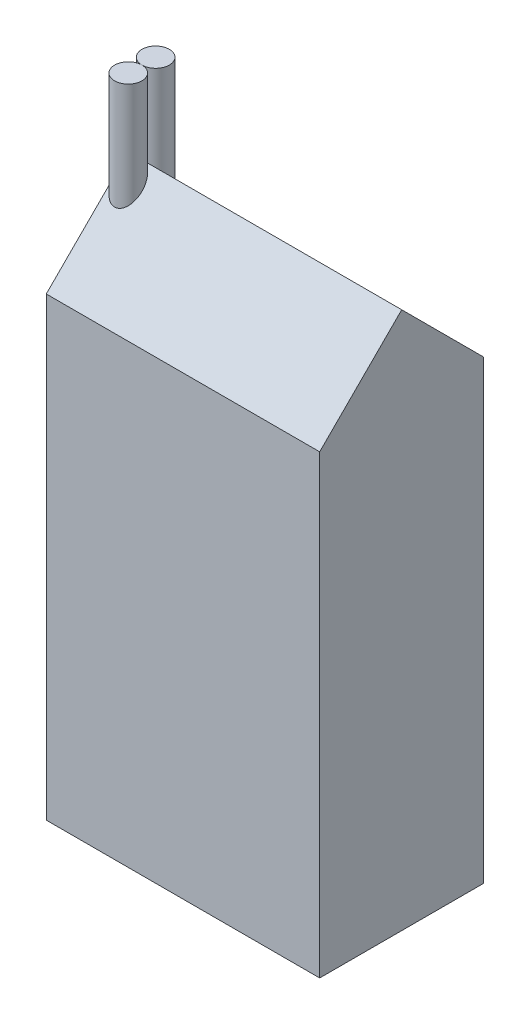
ISO-10303-21;
HEADER;
FILE_DESCRIPTION(('STEP AP214'),'2;1');
FILE_NAME('part.step','',(''),(''),'','','');
FILE_SCHEMA(('AUTOMOTIVE_DESIGN { 1 0 10303 214 1 1 1 1 }'));
ENDSEC;
DATA;
#1=APPLICATION_CONTEXT('core data for automotive mechanical design processes');
#2=APPLICATION_PROTOCOL_DEFINITION('international standard','automotive_design',2000,#1);
#3=PRODUCT_CONTEXT('',#1,'mechanical');
#4=PRODUCT('Part','Part','',(#3));
#5=PRODUCT_RELATED_PRODUCT_CATEGORY('part','',(#4));
#6=PRODUCT_DEFINITION_FORMATION('','',#4);
#7=PRODUCT_DEFINITION_CONTEXT('part definition',#1,'design');
#8=PRODUCT_DEFINITION('design','',#6,#7);
#9=PRODUCT_DEFINITION_SHAPE('','',#8);
#10=(LENGTH_UNIT() NAMED_UNIT(*) SI_UNIT(.MILLI.,.METRE.));
#11=(NAMED_UNIT(*) PLANE_ANGLE_UNIT() SI_UNIT($,.RADIAN.));
#12=(NAMED_UNIT(*) SI_UNIT($,.STERADIAN.) SOLID_ANGLE_UNIT());
#13=UNCERTAINTY_MEASURE_WITH_UNIT(LENGTH_MEASURE(1.E-05),#10,'distance_accuracy_value','');
#14=(GEOMETRIC_REPRESENTATION_CONTEXT(3) GLOBAL_UNCERTAINTY_ASSIGNED_CONTEXT((#13)) GLOBAL_UNIT_ASSIGNED_CONTEXT((#10,
#11,#12)) REPRESENTATION_CONTEXT('',''));
#15=CARTESIAN_POINT('',(0.,0.,0.));
#16=DIRECTION('',(0.,0.,1.));
#17=DIRECTION('',(1.,0.,0.));
#18=AXIS2_PLACEMENT_3D('',#15,#16,#17);
#19=CARTESIAN_POINT('',(-13.5,38.,-1.5));
#20=DIRECTION('',(0.,-1.,0.));
#21=DIRECTION('',(0.,0.,-1.));
#22=AXIS2_PLACEMENT_3D('',#19,#20,#21);
#23=CYLINDRICAL_SURFACE('',#22,1.5);
#24=CARTESIAN_POINT('',(-13.5,0.,-1.5));
#25=DIRECTION('',(0.,1.,0.));
#26=DIRECTION('',(0.,0.,1.));
#27=AXIS2_PLACEMENT_3D('',#24,#25,#26);
#28=CIRCLE('',#27,1.5);
#29=CARTESIAN_POINT('',(-13.5,0.,0.));
#30=VERTEX_POINT('',#29);
#31=EDGE_CURVE('E11',#30,#30,#28,.T.);
#32=ORIENTED_EDGE('',*,*,#31,.T.);
#33=EDGE_LOOP('',(#32));
#34=FACE_BOUND('',#33,.T.);
#35=CARTESIAN_POINT('',(-13.5,38.,-1.5));
#36=DIRECTION('',(0.,1.,0.));
#37=DIRECTION('',(0.,0.,1.));
#38=AXIS2_PLACEMENT_3D('',#35,#36,#37);
#39=CIRCLE('',#38,1.5);
#40=CARTESIAN_POINT('',(-13.5,38.,0.));
#41=VERTEX_POINT('',#40);
#42=EDGE_CURVE('E46',#41,#41,#39,.T.);
#43=ORIENTED_EDGE('',*,*,#42,.F.);
#44=EDGE_LOOP('',(#43));
#45=FACE_BOUND('',#44,.T.);
#46=ADVANCED_FACE('F42',(#34,#45),#23,.T.);
#47=CARTESIAN_POINT('',(-13.5,38.,-1.5));
#48=DIRECTION('',(0.,1.,0.));
#49=DIRECTION('',(0.,0.,1.));
#50=AXIS2_PLACEMENT_3D('',#47,#48,#49);
#51=PLANE('',#50);
#52=ORIENTED_EDGE('',*,*,#42,.T.);
#53=EDGE_LOOP('',(#52));
#54=FACE_BOUND('',#53,.T.);
#55=ADVANCED_FACE('F44',(#54),#51,.T.);
#56=CARTESIAN_POINT('',(-13.5,0.,-1.5));
#57=DIRECTION('',(0.,1.,0.));
#58=DIRECTION('',(0.,0.,1.));
#59=AXIS2_PLACEMENT_3D('',#56,#57,#58);
#60=PLANE('',#59);
#61=ORIENTED_EDGE('',*,*,#31,.F.);
#62=EDGE_LOOP('',(#61));
#63=FACE_BOUND('',#62,.T.);
#64=ADVANCED_FACE('F61',(#63),#60,.F.);
#65=CLOSED_SHELL('',(#46,#55,#64));
#66=MANIFOLD_SOLID_BREP('B2',#65);
#67=CARTESIAN_POINT('',(-13.5,38.,1.5));
#68=DIRECTION('',(0.,-1.,0.));
#69=DIRECTION('',(0.,0.,-1.));
#70=AXIS2_PLACEMENT_3D('',#67,#68,#69);
#71=CYLINDRICAL_SURFACE('',#70,1.5);
#72=CARTESIAN_POINT('',(-13.5,0.,1.5));
#73=DIRECTION('',(0.,-1.,0.));
#74=DIRECTION('',(0.,0.,-1.));
#75=AXIS2_PLACEMENT_3D('',#72,#73,#74);
#76=CIRCLE('',#75,1.5);
#77=CARTESIAN_POINT('',(-13.5,0.,0.));
#78=VERTEX_POINT('',#77);
#79=EDGE_CURVE('E95',#78,#78,#76,.T.);
#80=ORIENTED_EDGE('',*,*,#79,.F.);
#81=EDGE_LOOP('',(#80));
#82=FACE_BOUND('',#81,.T.);
#83=CARTESIAN_POINT('',(-13.5,38.,1.5));
#84=DIRECTION('',(0.,-1.,0.));
#85=DIRECTION('',(0.,0.,-1.));
#86=AXIS2_PLACEMENT_3D('',#83,#84,#85);
#87=CIRCLE('',#86,1.5);
#88=CARTESIAN_POINT('',(-13.5,38.,0.));
#89=VERTEX_POINT('',#88);
#90=EDGE_CURVE('E41',#89,#89,#87,.T.);
#91=ORIENTED_EDGE('',*,*,#90,.T.);
#92=EDGE_LOOP('',(#91));
#93=FACE_BOUND('',#92,.T.);
#94=ADVANCED_FACE('F92',(#82,#93),#71,.T.);
#95=CARTESIAN_POINT('',(-13.5,38.,1.5));
#96=DIRECTION('',(0.,-1.,0.));
#97=DIRECTION('',(0.,0.,-1.));
#98=AXIS2_PLACEMENT_3D('',#95,#96,#97);
#99=PLANE('',#98);
#100=ORIENTED_EDGE('',*,*,#90,.F.);
#101=EDGE_LOOP('',(#100));
#102=FACE_BOUND('',#101,.T.);
#103=ADVANCED_FACE('F107',(#102),#99,.F.);
#104=CARTESIAN_POINT('',(-13.5,0.,1.5));
#105=DIRECTION('',(0.,-1.,0.));
#106=DIRECTION('',(0.,0.,-1.));
#107=AXIS2_PLACEMENT_3D('',#104,#105,#106);
#108=PLANE('',#107);
#109=ORIENTED_EDGE('',*,*,#79,.T.);
#110=EDGE_LOOP('',(#109));
#111=FACE_BOUND('',#110,.T.);
#112=ADVANCED_FACE('F104',(#111),#108,.T.);
#113=CLOSED_SHELL('',(#94,#103,#112));
#114=MANIFOLD_SOLID_BREP('B6',#113);
#115=CARTESIAN_POINT('',(15.,-30.,9.));
#116=DIRECTION('',(-1.,0.,0.));
#117=DIRECTION('',(0.,0.,1.));
#118=AXIS2_PLACEMENT_3D('',#115,#116,#117);
#119=PLANE('',#118);
#120=DIRECTION('',(0.,1.,0.));
#121=VECTOR('',#120,1.);
#122=CARTESIAN_POINT('',(15.,-30.,-9.));
#123=LINE('',#122,#121);
#124=CARTESIAN_POINT('',(15.,-30.,-9.));
#125=VERTEX_POINT('',#124);
#126=CARTESIAN_POINT('',(15.,20.,-9.));
#127=VERTEX_POINT('',#126);
#128=EDGE_CURVE('E205',#125,#127,#123,.T.);
#129=ORIENTED_EDGE('',*,*,#128,.T.);
#130=DIRECTION('',(0.,0.707106781186549,0.707106781186547));
#131=VECTOR('',#130,1.);
#132=CARTESIAN_POINT('',(15.,30.,1.00000000000001));
#133=LINE('',#132,#131);
#134=CARTESIAN_POINT('',(15.,29.,0.));
#135=VERTEX_POINT('',#134);
#136=EDGE_CURVE('E143',#127,#135,#133,.T.);
#137=ORIENTED_EDGE('',*,*,#136,.T.);
#138=DIRECTION('',(0.,0.707106781186547,-0.707106781186549));
#139=VECTOR('',#138,1.);
#140=CARTESIAN_POINT('',(15.,20.,9.));
#141=LINE('',#140,#139);
#142=CARTESIAN_POINT('',(15.,20.,9.));
#143=VERTEX_POINT('',#142);
#144=EDGE_CURVE('E153',#135,#143,#141,.F.);
#145=ORIENTED_EDGE('',*,*,#144,.T.);
#146=DIRECTION('',(0.,1.,0.));
#147=VECTOR('',#146,1.);
#148=CARTESIAN_POINT('',(15.,-30.,9.));
#149=LINE('',#148,#147);
#150=CARTESIAN_POINT('',(15.,-30.,9.));
#151=VERTEX_POINT('',#150);
#152=EDGE_CURVE('E187',#151,#143,#149,.T.);
#153=ORIENTED_EDGE('',*,*,#152,.F.);
#154=DIRECTION('',(0.,0.,-1.));
#155=VECTOR('',#154,1.);
#156=CARTESIAN_POINT('',(15.,-30.,9.));
#157=LINE('',#156,#155);
#158=EDGE_CURVE('E197',#151,#125,#157,.T.);
#159=ORIENTED_EDGE('',*,*,#158,.T.);
#160=EDGE_LOOP('',(#129,#137,#145,#153,#159));
#161=FACE_BOUND('',#160,.T.);
#162=ADVANCED_FACE('F133',(#161),#119,.F.);
#163=CARTESIAN_POINT('',(-15.,-30.,9.));
#164=DIRECTION('',(1.,0.,0.));
#165=DIRECTION('',(0.,0.,-1.));
#166=AXIS2_PLACEMENT_3D('',#163,#164,#165);
#167=PLANE('',#166);
#168=DIRECTION('',(0.,-0.707106781186547,0.707106781186549));
#169=VECTOR('',#168,1.);
#170=CARTESIAN_POINT('',(-15.,20.,9.));
#171=LINE('',#170,#169);
#172=CARTESIAN_POINT('',(-15.,20.,9.));
#173=VERTEX_POINT('',#172);
#174=CARTESIAN_POINT('',(-15.,29.,0.));
#175=VERTEX_POINT('',#174);
#176=EDGE_CURVE('E196',#173,#175,#171,.F.);
#177=ORIENTED_EDGE('',*,*,#176,.T.);
#178=DIRECTION('',(0.,-0.707106781186549,-0.707106781186547));
#179=VECTOR('',#178,1.);
#180=CARTESIAN_POINT('',(-15.,30.,1.00000000000001));
#181=LINE('',#180,#179);
#182=CARTESIAN_POINT('',(-15.,20.,-9.));
#183=VERTEX_POINT('',#182);
#184=EDGE_CURVE('E211',#175,#183,#181,.T.);
#185=ORIENTED_EDGE('',*,*,#184,.T.);
#186=DIRECTION('',(0.,-1.,0.));
#187=VECTOR('',#186,1.);
#188=CARTESIAN_POINT('',(-15.,-30.,-9.));
#189=LINE('',#188,#187);
#190=CARTESIAN_POINT('',(-15.,-30.,-9.));
#191=VERTEX_POINT('',#190);
#192=EDGE_CURVE('E193',#183,#191,#189,.T.);
#193=ORIENTED_EDGE('',*,*,#192,.T.);
#194=DIRECTION('',(0.,0.,-1.));
#195=VECTOR('',#194,1.);
#196=CARTESIAN_POINT('',(-15.,-30.,9.));
#197=LINE('',#196,#195);
#198=CARTESIAN_POINT('',(-15.,-30.,9.));
#199=VERTEX_POINT('',#198);
#200=EDGE_CURVE('E190',#199,#191,#197,.T.);
#201=ORIENTED_EDGE('',*,*,#200,.F.);
#202=DIRECTION('',(0.,-1.,0.));
#203=VECTOR('',#202,1.);
#204=CARTESIAN_POINT('',(-15.,-30.,9.));
#205=LINE('',#204,#203);
#206=EDGE_CURVE('E178',#173,#199,#205,.T.);
#207=ORIENTED_EDGE('',*,*,#206,.F.);
#208=EDGE_LOOP('',(#177,#185,#193,#201,#207));
#209=FACE_BOUND('',#208,.T.);
#210=ADVANCED_FACE('F191',(#209),#167,.F.);
#211=CARTESIAN_POINT('',(-15.,-30.,9.));
#212=DIRECTION('',(0.,1.,0.));
#213=DIRECTION('',(0.,0.,1.));
#214=AXIS2_PLACEMENT_3D('',#211,#212,#213);
#215=PLANE('',#214);
#216=DIRECTION('',(1.,0.,0.));
#217=VECTOR('',#216,1.);
#218=CARTESIAN_POINT('',(-15.,-30.,-9.));
#219=LINE('',#218,#217);
#220=EDGE_CURVE('E208',#191,#125,#219,.T.);
#221=ORIENTED_EDGE('',*,*,#220,.T.);
#222=ORIENTED_EDGE('',*,*,#158,.F.);
#223=DIRECTION('',(1.,0.,0.));
#224=VECTOR('',#223,1.);
#225=CARTESIAN_POINT('',(-15.,-30.,9.));
#226=LINE('',#225,#224);
#227=EDGE_CURVE('E182',#199,#151,#226,.T.);
#228=ORIENTED_EDGE('',*,*,#227,.F.);
#229=ORIENTED_EDGE('',*,*,#200,.T.);
#230=EDGE_LOOP('',(#221,#222,#228,#229));
#231=FACE_BOUND('',#230,.T.);
#232=ADVANCED_FACE('F199',(#231),#215,.F.);
#233=CARTESIAN_POINT('',(0.,0.,9.));
#234=DIRECTION('',(0.,0.,-1.));
#235=DIRECTION('',(-1.,0.,0.));
#236=AXIS2_PLACEMENT_3D('',#233,#234,#235);
#237=PLANE('',#236);
#238=ORIENTED_EDGE('',*,*,#152,.T.);
#239=DIRECTION('',(-1.,0.,0.));
#240=VECTOR('',#239,1.);
#241=CARTESIAN_POINT('',(0.,20.,9.));
#242=LINE('',#241,#240);
#243=EDGE_CURVE('E90',#143,#173,#242,.T.);
#244=ORIENTED_EDGE('',*,*,#243,.T.);
#245=ORIENTED_EDGE('',*,*,#206,.T.);
#246=ORIENTED_EDGE('',*,*,#227,.T.);
#247=EDGE_LOOP('',(#238,#244,#245,#246));
#248=FACE_BOUND('',#247,.T.);
#249=ADVANCED_FACE('F180',(#248),#237,.F.);
#250=CARTESIAN_POINT('',(0.,0.,-9.));
#251=DIRECTION('',(0.,0.,-1.));
#252=DIRECTION('',(-1.,0.,0.));
#253=AXIS2_PLACEMENT_3D('',#250,#251,#252);
#254=PLANE('',#253);
#255=ORIENTED_EDGE('',*,*,#192,.F.);
#256=DIRECTION('',(1.,0.,0.));
#257=VECTOR('',#256,1.);
#258=CARTESIAN_POINT('',(15.,20.,-9.));
#259=LINE('',#258,#257);
#260=EDGE_CURVE('E213',#183,#127,#259,.T.);
#261=ORIENTED_EDGE('',*,*,#260,.T.);
#262=ORIENTED_EDGE('',*,*,#128,.F.);
#263=ORIENTED_EDGE('',*,*,#220,.F.);
#264=EDGE_LOOP('',(#255,#261,#262,#263));
#265=FACE_BOUND('',#264,.T.);
#266=ADVANCED_FACE('F220',(#265),#254,.T.);
#267=CARTESIAN_POINT('',(0.,20.,9.));
#268=DIRECTION('',(0.,-0.707106781186549,-0.707106781186547));
#269=DIRECTION('',(-1.,0.,0.));
#270=AXIS2_PLACEMENT_3D('',#267,#268,#269);
#271=PLANE('',#270);
#272=ORIENTED_EDGE('',*,*,#243,.F.);
#273=ORIENTED_EDGE('',*,*,#144,.F.);
#274=DIRECTION('',(-1.,0.,0.));
#275=VECTOR('',#274,1.);
#276=CARTESIAN_POINT('',(-15.,29.,0.));
#277=LINE('',#276,#275);
#278=EDGE_CURVE('E138',#175,#135,#277,.F.);
#279=ORIENTED_EDGE('',*,*,#278,.F.);
#280=ORIENTED_EDGE('',*,*,#176,.F.);
#281=EDGE_LOOP('',(#272,#273,#279,#280));
#282=FACE_BOUND('',#281,.T.);
#283=ADVANCED_FACE('F136',(#282),#271,.F.);
#284=CARTESIAN_POINT('',(-15.,30.,1.00000000000001));
#285=DIRECTION('',(0.,0.707106781186547,-0.707106781186549));
#286=DIRECTION('',(1.,0.,0.));
#287=AXIS2_PLACEMENT_3D('',#284,#285,#286);
#288=PLANE('',#287);
#289=ORIENTED_EDGE('',*,*,#136,.F.);
#290=ORIENTED_EDGE('',*,*,#260,.F.);
#291=ORIENTED_EDGE('',*,*,#184,.F.);
#292=ORIENTED_EDGE('',*,*,#278,.T.);
#293=EDGE_LOOP('',(#289,#290,#291,#292));
#294=FACE_BOUND('',#293,.T.);
#295=ADVANCED_FACE('F226',(#294),#288,.T.);
#296=CLOSED_SHELL('',(#162,#210,#232,#249,#266,#283,#295));
#297=MANIFOLD_SOLID_BREP('B36',#296);
#298=ADVANCED_BREP_SHAPE_REPRESENTATION('',(#18,#66,#114,#297),#14);
#299=SHAPE_DEFINITION_REPRESENTATION(#9,#298);
ENDSEC;
END-ISO-10303-21;
